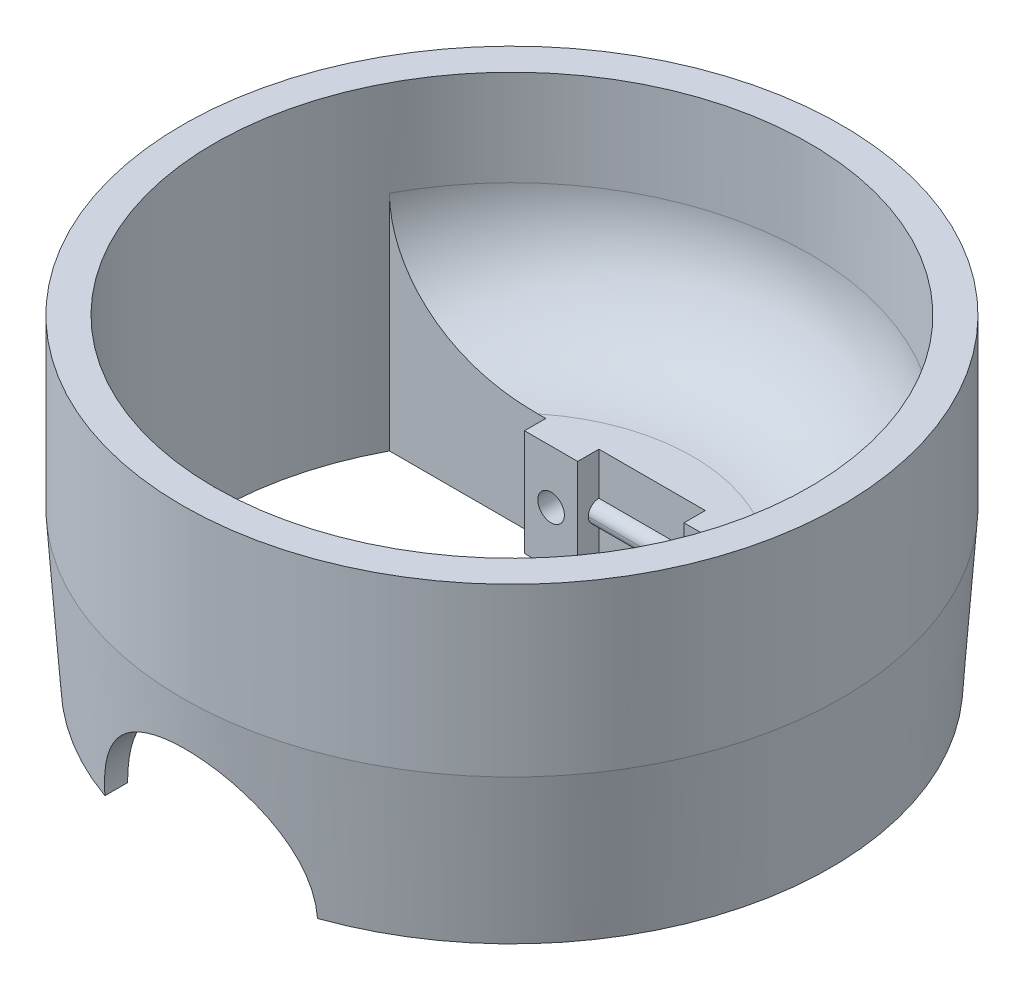
ISO-10303-21;
HEADER;
FILE_DESCRIPTION(('STEP AP214'),'2;1');
FILE_NAME('part.step','',(''),(''),'','','');
FILE_SCHEMA(('AUTOMOTIVE_DESIGN { 1 0 10303 214 1 1 1 1 }'));
ENDSEC;
DATA;
#1=APPLICATION_CONTEXT('core data for automotive mechanical design processes');
#2=APPLICATION_PROTOCOL_DEFINITION('international standard','automotive_design',2000,#1);
#3=PRODUCT_CONTEXT('',#1,'mechanical');
#4=PRODUCT('Part','Part','',(#3));
#5=PRODUCT_RELATED_PRODUCT_CATEGORY('part','',(#4));
#6=PRODUCT_DEFINITION_FORMATION('','',#4);
#7=PRODUCT_DEFINITION_CONTEXT('part definition',#1,'design');
#8=PRODUCT_DEFINITION('design','',#6,#7);
#9=PRODUCT_DEFINITION_SHAPE('','',#8);
#10=(LENGTH_UNIT() NAMED_UNIT(*) SI_UNIT(.MILLI.,.METRE.));
#11=(NAMED_UNIT(*) PLANE_ANGLE_UNIT() SI_UNIT($,.RADIAN.));
#12=(NAMED_UNIT(*) SI_UNIT($,.STERADIAN.) SOLID_ANGLE_UNIT());
#13=UNCERTAINTY_MEASURE_WITH_UNIT(LENGTH_MEASURE(1.E-05),#10,'distance_accuracy_value','');
#14=(GEOMETRIC_REPRESENTATION_CONTEXT(3) GLOBAL_UNCERTAINTY_ASSIGNED_CONTEXT((#13)) GLOBAL_UNIT_ASSIGNED_CONTEXT((#10,
#11,#12)) REPRESENTATION_CONTEXT('',''));
#15=CARTESIAN_POINT('',(0.,0.,0.));
#16=DIRECTION('',(0.,0.,1.));
#17=DIRECTION('',(1.,0.,0.));
#18=AXIS2_PLACEMENT_3D('',#15,#16,#17);
#19=CARTESIAN_POINT('',(-24.7019057064772,-20.,-13.1839240921779));
#20=DIRECTION('',(0.,0.,1.));
#21=DIRECTION('',(1.,0.,0.));
#22=AXIS2_PLACEMENT_3D('',#19,#20,#21);
#23=PLANE('',#22);
#24=DIRECTION('',(0.,-1.,0.));
#25=VECTOR('',#24,1.);
#26=CARTESIAN_POINT('',(5.,0.,-13.1839240921779));
#27=LINE('',#26,#25);
#28=CARTESIAN_POINT('',(5.,-26.,-13.1839240921779));
#29=VERTEX_POINT('',#28);
#30=CARTESIAN_POINT('',(5.,-30.,-13.1839240921779));
#31=VERTEX_POINT('',#30);
#32=EDGE_CURVE('E216',#29,#31,#27,.T.);
#33=ORIENTED_EDGE('',*,*,#32,.F.);
#34=DIRECTION('',(1.,0.,0.));
#35=VECTOR('',#34,1.);
#36=CARTESIAN_POINT('',(0.,-26.,-13.1839240921779));
#37=LINE('',#36,#35);
#38=CARTESIAN_POINT('',(-5.,-26.,-13.1839240921779));
#39=VERTEX_POINT('',#38);
#40=EDGE_CURVE('E188',#39,#29,#37,.T.);
#41=ORIENTED_EDGE('',*,*,#40,.F.);
#42=DIRECTION('',(0.,-1.,0.));
#43=VECTOR('',#42,1.);
#44=CARTESIAN_POINT('',(-5.,0.,-13.1839240921779));
#45=LINE('',#44,#43);
#46=CARTESIAN_POINT('',(-5.,-30.,-13.1839240921779));
#47=VERTEX_POINT('',#46);
#48=EDGE_CURVE('E185',#39,#47,#45,.T.);
#49=ORIENTED_EDGE('',*,*,#48,.T.);
#50=DIRECTION('',(-1.,0.,0.));
#51=VECTOR('',#50,1.);
#52=CARTESIAN_POINT('',(-24.7019057064772,-30.,-13.1839240921779));
#53=LINE('',#52,#51);
#54=EDGE_CURVE('E347',#31,#47,#53,.T.);
#55=ORIENTED_EDGE('',*,*,#54,.F.);
#56=EDGE_LOOP('',(#33,#41,#49,#55));
#57=FACE_BOUND('',#56,.T.);
#58=ADVANCED_FACE('F41',(#57),#23,.T.);
#59=DIRECTION('',(1.,0.,0.));
#60=VECTOR('',#59,1.);
#61=CARTESIAN_POINT('',(0.,-24.,-13.1839240921779));
#62=LINE('',#61,#60);
#63=CARTESIAN_POINT('',(-5.,-24.,-13.1839240921779));
#64=VERTEX_POINT('',#63);
#65=CARTESIAN_POINT('',(5.,-24.,-13.1839240921779));
#66=VERTEX_POINT('',#65);
#67=EDGE_CURVE('E180',#64,#66,#62,.T.);
#68=ORIENTED_EDGE('',*,*,#67,.T.);
#69=CARTESIAN_POINT('',(5.,-20.,-13.1839240921779));
#70=VERTEX_POINT('',#69);
#71=EDGE_CURVE('E203',#70,#66,#27,.T.);
#72=ORIENTED_EDGE('',*,*,#71,.F.);
#73=DIRECTION('',(-1.,0.,0.));
#74=VECTOR('',#73,1.);
#75=CARTESIAN_POINT('',(-24.7019057064772,-20.,-13.1839240921779));
#76=LINE('',#75,#74);
#77=CARTESIAN_POINT('',(-5.,-20.,-13.1839240921779));
#78=VERTEX_POINT('',#77);
#79=EDGE_CURVE('E182',#70,#78,#76,.T.);
#80=ORIENTED_EDGE('',*,*,#79,.T.);
#81=EDGE_CURVE('E166',#78,#64,#45,.T.);
#82=ORIENTED_EDGE('',*,*,#81,.T.);
#83=EDGE_LOOP('',(#68,#72,#80,#82));
#84=FACE_BOUND('',#83,.T.);
#85=ADVANCED_FACE('F178',(#84),#23,.T.);
#86=DIRECTION('',(0.,-1.,0.));
#87=VECTOR('',#86,1.);
#88=CARTESIAN_POINT('',(10.,0.,-13.1839240921779));
#89=LINE('',#88,#87);
#90=CARTESIAN_POINT('',(10.,-20.,-13.1839240921779));
#91=VERTEX_POINT('',#90);
#92=CARTESIAN_POINT('',(10.,-30.,-13.1839240921779));
#93=VERTEX_POINT('',#92);
#94=EDGE_CURVE('E192',#91,#93,#89,.T.);
#95=ORIENTED_EDGE('',*,*,#94,.T.);
#96=CARTESIAN_POINT('',(24.7019057064772,-30.,-13.1839240921779));
#97=VERTEX_POINT('',#96);
#98=EDGE_CURVE('E348',#97,#93,#53,.T.);
#99=ORIENTED_EDGE('',*,*,#98,.F.);
#100=DIRECTION('',(0.,-1.,0.));
#101=VECTOR('',#100,1.);
#102=CARTESIAN_POINT('',(24.7019057064772,-20.,-13.1839240921779));
#103=LINE('',#102,#101);
#104=CARTESIAN_POINT('',(24.7019057064772,-9.,-13.1839240921779));
#105=VERTEX_POINT('',#104);
#106=EDGE_CURVE('E362',#105,#97,#103,.T.);
#107=ORIENTED_EDGE('',*,*,#106,.F.);
#108=CARTESIAN_POINT('',(24.7019057064772,-9.,-13.1839240921779));
#109=CARTESIAN_POINT('',(24.7019507783362,-9.27982644663343,-13.1839240921779));
#110=CARTESIAN_POINT('',(24.6898044805069,-9.55964059119396,-13.1839240921779));
#111=CARTESIAN_POINT('',(24.6414590490719,-10.1171294383438,-13.1839240921779));
#112=CARTESIAN_POINT('',(24.6052646821188,-10.394804553886,-13.1839240921779));
#113=CARTESIAN_POINT('',(24.509300887252,-10.9451636026621,-13.1839240921779));
#114=CARTESIAN_POINT('',(24.4496044632105,-11.2178602813995,-13.1839240921779));
#115=CARTESIAN_POINT('',(24.3072583488006,-11.757193561209,-13.1839240921779));
#116=CARTESIAN_POINT('',(24.2246083214414,-12.0238300732472,-13.1839240921779));
#117=CARTESIAN_POINT('',(24.0372112200552,-12.5491168110302,-13.1839240921779));
#118=CARTESIAN_POINT('',(23.9324712234703,-12.8077695643504,-13.1839240921779));
#119=CARTESIAN_POINT('',(23.7018983862071,-13.3154991518267,-13.1839240921779));
#120=CARTESIAN_POINT('',(23.5760646086041,-13.5645755600248,-13.1839240921779));
#121=CARTESIAN_POINT('',(23.3044322203473,-14.0517395184423,-13.1839240921779));
#122=CARTESIAN_POINT('',(23.1586239372842,-14.2898216696864,-13.1839240921779));
#123=CARTESIAN_POINT('',(22.8484184771743,-14.7535391313424,-13.1839240921779));
#124=CARTESIAN_POINT('',(22.6840209857017,-14.9791742311236,-13.1839240921779));
#125=CARTESIAN_POINT('',(22.3327163499352,-15.4236427412816,-13.1839240921779));
#126=CARTESIAN_POINT('',(22.1452702508676,-15.642049910618,-13.1839240921779));
#127=CARTESIAN_POINT('',(21.7537936591684,-16.0634376349728,-13.1839240921779));
#128=CARTESIAN_POINT('',(21.549762883154,-16.2664179262771,-13.1839240921779));
#129=CARTESIAN_POINT('',(21.1269375121556,-16.6560774566455,-13.1839240921779));
#130=CARTESIAN_POINT('',(20.9081519514772,-16.8427665129788,-13.1839240921779));
#131=CARTESIAN_POINT('',(20.4573851965118,-17.1994811308012,-13.1839240921779));
#132=CARTESIAN_POINT('',(20.2254026151171,-17.369504935512,-13.1839240921779));
#133=CARTESIAN_POINT('',(19.7264926113907,-17.7085048747275,-13.1839240921779));
#134=CARTESIAN_POINT('',(19.4583739496668,-17.8757279612194,-13.1839240921779));
#135=CARTESIAN_POINT('',(18.9103730872713,-18.1896210332199,-13.1839240921779));
#136=CARTESIAN_POINT('',(18.6304898333286,-18.3362891733499,-13.1839240921779));
#137=CARTESIAN_POINT('',(18.0601205947954,-18.6096921459424,-13.1839240921779));
#138=CARTESIAN_POINT('',(17.7696048443542,-18.7363647445235,-13.1839240921779));
#139=CARTESIAN_POINT('',(17.1807227297072,-18.969704554264,-13.1839240921779));
#140=CARTESIAN_POINT('',(16.8823568808151,-19.0763730748583,-13.1839240921779));
#141=CARTESIAN_POINT('',(16.1086431771858,-19.3253978749337,-13.1839240921779));
#142=CARTESIAN_POINT('',(15.6287489220259,-19.4537592409069,-13.1839240921779));
#143=CARTESIAN_POINT('',(14.6590162853255,-19.6670157596428,-13.1839240921779));
#144=CARTESIAN_POINT('',(14.1691661889671,-19.7518562063045,-13.1839240921779));
#145=CARTESIAN_POINT('',(13.1882927228058,-19.8821958455143,-13.1839240921779));
#146=CARTESIAN_POINT('',(12.6973091186484,-19.9280002201832,-13.1839240921779));
#147=CARTESIAN_POINT('',(11.960210248636,-19.9721680445016,-13.1839240921779));
#148=CARTESIAN_POINT('',(11.7147321228962,-19.9828029414737,-13.1839240921779));
#149=CARTESIAN_POINT('',(11.2236322997369,-19.9967197069818,-13.1839240921779));
#150=CARTESIAN_POINT('',(10.9780106616034,-20.0000036293571,-13.1839240921779));
#151=CARTESIAN_POINT('',(10.7323876901504,-20.,-13.1839240921779));
#152=B_SPLINE_CURVE_WITH_KNOTS('',3,(#108,#109,#110,#111,#112,#113,#114,#115,#116,#117,#118,
#119,#120,#121,#122,#123,#124,#125,#126,#127,#128,#129,#130,#131,#132,#133,#134,#135,#136,#137,
#138,#139,#140,#141,#142,#143,#144,#145,#146,#147,#148,#149,#150,#151),.UNSPECIFIED.,.F.,.F.,(4,
2,2,2,2,2,2,2,2,2,2,2,2,2,2,2,2,2,2,2,2,4),(0.,0.839197067847004,1.67822784509287,
2.51467266834941,3.35112977242514,4.18731928863131,5.02354595580059,5.86017899633741,
6.69682619016163,7.55935118826625,8.42189092745133,9.28390724908399,10.1460143432244,
11.0930449518426,12.0401605284291,12.9901681230241,13.9401135099279,15.4279767727252,
16.9177057351677,18.3956783400627,19.1327156267729,19.8695469618545),.UNSPECIFIED.);
#153=CARTESIAN_POINT('',(10.7323876901504,-20.,-13.1839240921779));
#154=VERTEX_POINT('',#153);
#155=EDGE_CURVE('E55',#105,#154,#152,.T.);
#156=ORIENTED_EDGE('',*,*,#155,.T.);
#157=EDGE_CURVE('E269',#154,#91,#76,.T.);
#158=ORIENTED_EDGE('',*,*,#157,.T.);
#159=EDGE_LOOP('',(#95,#99,#107,#156,#158));
#160=FACE_BOUND('',#159,.T.);
#161=ADVANCED_FACE('F334',(#160),#23,.T.);
#162=CARTESIAN_POINT('',(-10.,-30.,-13.1839240921779));
#163=VERTEX_POINT('',#162);
#164=CARTESIAN_POINT('',(-24.7019057064772,-30.,-13.1839240921779));
#165=VERTEX_POINT('',#164);
#166=EDGE_CURVE('E268',#163,#165,#53,.T.);
#167=ORIENTED_EDGE('',*,*,#166,.F.);
#168=DIRECTION('',(0.,-1.,0.));
#169=VECTOR('',#168,1.);
#170=CARTESIAN_POINT('',(-10.,0.,-13.1839240921779));
#171=LINE('',#170,#169);
#172=CARTESIAN_POINT('',(-10.,-20.,-13.1839240921779));
#173=VERTEX_POINT('',#172);
#174=EDGE_CURVE('E229',#173,#163,#171,.T.);
#175=ORIENTED_EDGE('',*,*,#174,.F.);
#176=CARTESIAN_POINT('',(-10.7323876901504,-20.,-13.1839240921779));
#177=VERTEX_POINT('',#176);
#178=EDGE_CURVE('E359',#173,#177,#76,.T.);
#179=ORIENTED_EDGE('',*,*,#178,.T.);
#180=CARTESIAN_POINT('',(-10.7323876901504,-20.,-13.1839240921779));
#181=CARTESIAN_POINT('',(-11.0218787992796,-20.0000141704791,-13.1839240921779));
#182=CARTESIAN_POINT('',(-11.3114184178669,-19.9954451439697,-13.1839240921779));
#183=CARTESIAN_POINT('',(-11.8902745328998,-19.9759055288924,-13.1839240921779));
#184=CARTESIAN_POINT('',(-12.1795908617473,-19.960930078426,-13.1839240921779));
#185=CARTESIAN_POINT('',(-12.7587993681966,-19.9192400342375,-13.1839240921779));
#186=CARTESIAN_POINT('',(-13.0486876143698,-19.8924692817555,-13.1839240921779));
#187=CARTESIAN_POINT('',(-13.6269578544484,-19.8260393365202,-13.1839240921779));
#188=CARTESIAN_POINT('',(-13.9153400538652,-19.7863819515493,-13.1839240921779));
#189=CARTESIAN_POINT('',(-14.4927088492038,-19.6926635840186,-13.1839240921779));
#190=CARTESIAN_POINT('',(-14.7816731054147,-19.6384637356711,-13.1839240921779));
#191=CARTESIAN_POINT('',(-15.356330967273,-19.5148790261105,-13.1839240921779));
#192=CARTESIAN_POINT('',(-15.6420248334325,-19.4454953833889,-13.1839240921779));
#193=CARTESIAN_POINT('',(-16.2085058932891,-19.2908439103934,-13.1839240921779));
#194=CARTESIAN_POINT('',(-16.4893015533208,-19.2056072528542,-13.1839240921779));
#195=CARTESIAN_POINT('',(-17.0452362661913,-19.0184855999594,-13.1839240921779));
#196=CARTESIAN_POINT('',(-17.320376518838,-18.9166041777409,-13.1839240921779));
#197=CARTESIAN_POINT('',(-17.9035295658578,-18.6794250430918,-13.1839240921779));
#198=CARTESIAN_POINT('',(-18.210448741728,-18.5414181273483,-13.1839240921779));
#199=CARTESIAN_POINT('',(-18.8128428827323,-18.2422365687576,-13.1839240921779));
#200=CARTESIAN_POINT('',(-19.1083169102506,-18.0810600328701,-13.1839240921779));
#201=CARTESIAN_POINT('',(-19.6842058884858,-17.7360331813031,-13.1839240921779));
#202=CARTESIAN_POINT('',(-19.9646746779218,-17.5522729996891,-13.1839240921779));
#203=CARTESIAN_POINT('',(-20.5091758599231,-17.1617980955601,-13.1839240921779));
#204=CARTESIAN_POINT('',(-20.7732088764774,-16.9550842453184,-13.1839240921779));
#205=CARTESIAN_POINT('',(-21.2842274284973,-16.5175513542208,-13.1839240921779));
#206=CARTESIAN_POINT('',(-21.5310589288472,-16.286551961841,-13.1839240921779));
#207=CARTESIAN_POINT('',(-22.0025770623019,-15.8028961323451,-13.1839240921779));
#208=CARTESIAN_POINT('',(-22.2272626150121,-15.5502386397573,-13.1839240921779));
#209=CARTESIAN_POINT('',(-22.6520044514805,-15.0245311850881,-13.1839240921779));
#210=CARTESIAN_POINT('',(-22.8520344519494,-14.7514599511422,-13.1839240921779));
#211=CARTESIAN_POINT('',(-23.2246043806973,-14.1871822776315,-13.1839240921779));
#212=CARTESIAN_POINT('',(-23.3971486322939,-13.895978700201,-13.1839240921779));
#213=CARTESIAN_POINT('',(-23.6963134568623,-13.3284705142301,-13.1839240921779));
#214=CARTESIAN_POINT('',(-23.8258257862493,-13.0536871267521,-13.1839240921779));
#215=CARTESIAN_POINT('',(-24.0593756556695,-12.493507902747,-13.1839240921779));
#216=CARTESIAN_POINT('',(-24.1634159664085,-12.208113224351,-13.1839240921779));
#217=CARTESIAN_POINT('',(-24.3446338208219,-11.629539751225,-13.1839240921779));
#218=CARTESIAN_POINT('',(-24.421863917977,-11.3363774114555,-13.1839240921779));
#219=CARTESIAN_POINT('',(-24.5487895556623,-10.7442863145121,-13.1839240921779));
#220=CARTESIAN_POINT('',(-24.5985010729015,-10.4453610077443,-13.1839240921779));
#221=CARTESIAN_POINT('',(-24.6567339252384,-9.95475388603851,-13.1839240921779));
#222=CARTESIAN_POINT('',(-24.6736788498507,-9.7640329957569,-13.1839240921779));
#223=CARTESIAN_POINT('',(-24.6962589744793,-9.38221645300072,-13.1839240921779));
#224=CARTESIAN_POINT('',(-24.7019114658686,-9.19112182268412,-13.1839240921779));
#225=CARTESIAN_POINT('',(-24.7019057064772,-9.,-13.1839240921779));
#226=B_SPLINE_CURVE_WITH_KNOTS('',3,(#180,#181,#182,#183,#184,#185,#186,#187,#188,#189,#190,
#191,#192,#193,#194,#195,#196,#197,#198,#199,#200,#201,#202,#203,#204,#205,#206,#207,#208,#209,
#210,#211,#212,#213,#214,#215,#216,#217,#218,#219,#220,#221,#222,#223,#224,#225),.UNSPECIFIED.,
.F.,.F.,(4,2,2,2,2,2,2,2,2,2,2,2,2,2,2,2,2,2,2,2,2,2,4),(0.,0.868509246433922,1.7374245348834,
2.61052229999916,3.48349763670163,4.36512549317318,5.24668262540023,6.12652428261805,
7.00617731153202,8.01477900612634,9.02346315394461,10.0282448489454,11.0329883738127,
12.0458055938371,13.0586721999259,14.0726093705996,15.0863868981689,15.9965036522632,
16.9065213648515,17.8147450490537,18.7224408831645,19.2965489996396,19.8697773455954),.UNSPECIFIED.);
#227=CARTESIAN_POINT('',(-24.7019057064772,-9.,-13.1839240921779));
#228=VERTEX_POINT('',#227);
#229=EDGE_CURVE('E11',#177,#228,#226,.T.);
#230=ORIENTED_EDGE('',*,*,#229,.T.);
#231=DIRECTION('',(0.,-1.,0.));
#232=VECTOR('',#231,1.);
#233=CARTESIAN_POINT('',(-24.7019057064772,-20.,-13.1839240921779));
#234=LINE('',#233,#232);
#235=EDGE_CURVE('E344',#228,#165,#234,.T.);
#236=ORIENTED_EDGE('',*,*,#235,.T.);
#237=EDGE_LOOP('',(#167,#175,#179,#230,#236));
#238=FACE_BOUND('',#237,.T.);
#239=ADVANCED_FACE('F316',(#238),#23,.T.);
#240=CARTESIAN_POINT('',(0.,-30.,0.));
#241=DIRECTION('',(0.,1.,0.));
#242=DIRECTION('',(0.,0.,1.));
#243=AXIS2_PLACEMENT_3D('',#240,#241,#242);
#244=CYLINDRICAL_SURFACE('',#243,31.);
#245=CARTESIAN_POINT('',(0.,-15.6993337432872,0.));
#246=DIRECTION('',(0.,1.,0.));
#247=DIRECTION('',(0.,0.,1.));
#248=AXIS2_PLACEMENT_3D('',#245,#246,#247);
#249=CIRCLE('',#248,31.);
#250=CARTESIAN_POINT('',(10.3333333333334,-15.6993337432872,29.227080289044));
#251=VERTEX_POINT('',#250);
#252=EDGE_CURVE('E382',#251,#251,#249,.T.);
#253=ORIENTED_EDGE('',*,*,#252,.T.);
#254=EDGE_LOOP('',(#253));
#255=FACE_BOUND('',#254,.T.);
#256=CARTESIAN_POINT('',(0.,0.,0.));
#257=DIRECTION('',(0.,1.,0.));
#258=DIRECTION('',(0.,0.,1.));
#259=AXIS2_PLACEMENT_3D('',#256,#257,#258);
#260=CIRCLE('',#259,31.);
#261=CARTESIAN_POINT('',(0.,0.,31.));
#262=VERTEX_POINT('',#261);
#263=EDGE_CURVE('E373',#262,#262,#260,.T.);
#264=ORIENTED_EDGE('',*,*,#263,.F.);
#265=EDGE_LOOP('',(#264));
#266=FACE_BOUND('',#265,.T.);
#267=ADVANCED_FACE('F312',(#255,#266),#244,.T.);
#268=CARTESIAN_POINT('',(0.,-30.,0.));
#269=DIRECTION('',(0.,1.,0.));
#270=DIRECTION('',(0.,0.,1.));
#271=AXIS2_PLACEMENT_3D('',#268,#269,#270);
#272=PLANE('',#271);
#273=DIRECTION('',(0.,0.,-1.));
#274=VECTOR('',#273,1.);
#275=CARTESIAN_POINT('',(-10.,-30.,37.8160759078221));
#276=LINE('',#275,#274);
#277=CARTESIAN_POINT('',(-10.,-30.,28.2842712474618));
#278=VERTEX_POINT('',#277);
#279=CARTESIAN_POINT('',(-10.,-30.,26.153393661244));
#280=VERTEX_POINT('',#279);
#281=EDGE_CURVE('E257',#278,#280,#276,.T.);
#282=ORIENTED_EDGE('',*,*,#281,.F.);
#283=CARTESIAN_POINT('',(0.,-30.,0.));
#284=DIRECTION('',(0.,1.,0.));
#285=DIRECTION('',(0.,0.,1.));
#286=AXIS2_PLACEMENT_3D('',#283,#284,#285);
#287=CIRCLE('',#286,29.9999999999999);
#288=CARTESIAN_POINT('',(10.,-30.,28.2842712474618));
#289=VERTEX_POINT('',#288);
#290=EDGE_CURVE('E294',#278,#289,#287,.F.);
#291=ORIENTED_EDGE('',*,*,#290,.T.);
#292=DIRECTION('',(0.,0.,-1.));
#293=VECTOR('',#292,1.);
#294=CARTESIAN_POINT('',(10.,-30.,37.8160759078221));
#295=LINE('',#294,#293);
#296=CARTESIAN_POINT('',(10.,-30.,26.153393661244));
#297=VERTEX_POINT('',#296);
#298=EDGE_CURVE('E255',#289,#297,#295,.T.);
#299=ORIENTED_EDGE('',*,*,#298,.T.);
#300=CARTESIAN_POINT('',(0.,-30.,0.));
#301=DIRECTION('',(0.,1.,0.));
#302=DIRECTION('',(0.,0.,1.));
#303=AXIS2_PLACEMENT_3D('',#300,#301,#302);
#304=CIRCLE('',#303,28.);
#305=EDGE_CURVE('E374',#297,#97,#304,.T.);
#306=ORIENTED_EDGE('',*,*,#305,.T.);
#307=ORIENTED_EDGE('',*,*,#98,.T.);
#308=DIRECTION('',(0.,0.,-1.));
#309=VECTOR('',#308,1.);
#310=CARTESIAN_POINT('',(10.,-30.,-11.1839240921779));
#311=LINE('',#310,#309);
#312=CARTESIAN_POINT('',(10.,-30.,-11.1839240921779));
#313=VERTEX_POINT('',#312);
#314=EDGE_CURVE('E214',#313,#93,#311,.T.);
#315=ORIENTED_EDGE('',*,*,#314,.F.);
#316=DIRECTION('',(1.,0.,0.));
#317=VECTOR('',#316,1.);
#318=CARTESIAN_POINT('',(0.,-30.,-11.1839240921779));
#319=LINE('',#318,#317);
#320=CARTESIAN_POINT('',(5.,-30.,-11.1839240921779));
#321=VERTEX_POINT('',#320);
#322=EDGE_CURVE('E212',#321,#313,#319,.T.);
#323=ORIENTED_EDGE('',*,*,#322,.F.);
#324=DIRECTION('',(0.,0.,-1.));
#325=VECTOR('',#324,1.);
#326=CARTESIAN_POINT('',(5.,-30.,-11.1839240921779));
#327=LINE('',#326,#325);
#328=EDGE_CURVE('E220',#321,#31,#327,.T.);
#329=ORIENTED_EDGE('',*,*,#328,.T.);
#330=ORIENTED_EDGE('',*,*,#54,.T.);
#331=DIRECTION('',(0.,0.,-1.));
#332=VECTOR('',#331,1.);
#333=CARTESIAN_POINT('',(-5.,-30.,-11.1839240921779));
#334=LINE('',#333,#332);
#335=CARTESIAN_POINT('',(-5.,-30.,-11.1839240921779));
#336=VERTEX_POINT('',#335);
#337=EDGE_CURVE('E246',#336,#47,#334,.T.);
#338=ORIENTED_EDGE('',*,*,#337,.F.);
#339=DIRECTION('',(1.,0.,0.));
#340=VECTOR('',#339,1.);
#341=CARTESIAN_POINT('',(0.,-30.,-11.1839240921779));
#342=LINE('',#341,#340);
#343=CARTESIAN_POINT('',(-10.,-30.,-11.1839240921779));
#344=VERTEX_POINT('',#343);
#345=EDGE_CURVE('E237',#344,#336,#342,.T.);
#346=ORIENTED_EDGE('',*,*,#345,.F.);
#347=DIRECTION('',(0.,0.,-1.));
#348=VECTOR('',#347,1.);
#349=CARTESIAN_POINT('',(-10.,-30.,-11.1839240921779));
#350=LINE('',#349,#348);
#351=EDGE_CURVE('E249',#344,#163,#350,.T.);
#352=ORIENTED_EDGE('',*,*,#351,.T.);
#353=ORIENTED_EDGE('',*,*,#166,.T.);
#354=EDGE_CURVE('E371',#165,#280,#304,.T.);
#355=ORIENTED_EDGE('',*,*,#354,.T.);
#356=EDGE_LOOP('',(#282,#291,#299,#306,#307,#315,#323,#329,#330,#338,#346,#352,#353,#355));
#357=FACE_BOUND('',#356,.T.);
#358=ADVANCED_FACE('F315',(#357),#272,.F.);
#359=CARTESIAN_POINT('',(0.,-30.,0.));
#360=DIRECTION('',(0.,1.,0.));
#361=DIRECTION('',(0.,0.,1.));
#362=AXIS2_PLACEMENT_3D('',#359,#360,#361);
#363=CYLINDRICAL_SURFACE('',#362,28.);
#364=CARTESIAN_POINT('',(0.,0.,0.));
#365=DIRECTION('',(0.,1.,0.));
#366=DIRECTION('',(0.,0.,1.));
#367=AXIS2_PLACEMENT_3D('',#364,#365,#366);
#368=CIRCLE('',#367,28.);
#369=CARTESIAN_POINT('',(0.,0.,28.));
#370=VERTEX_POINT('',#369);
#371=EDGE_CURVE('E368',#370,#370,#368,.T.);
#372=ORIENTED_EDGE('',*,*,#371,.T.);
#373=EDGE_LOOP('',(#372));
#374=FACE_BOUND('',#373,.T.);
#375=CARTESIAN_POINT('',(0.,-9.,0.));
#376=DIRECTION('',(0.,-1.,0.));
#377=DIRECTION('',(0.,0.,-1.));
#378=AXIS2_PLACEMENT_3D('',#375,#376,#377);
#379=CIRCLE('',#378,28.);
#380=EDGE_CURVE('E293',#228,#105,#379,.T.);
#381=ORIENTED_EDGE('',*,*,#380,.T.);
#382=ORIENTED_EDGE('',*,*,#106,.T.);
#383=ORIENTED_EDGE('',*,*,#305,.F.);
#384=CARTESIAN_POINT('',(-10.,-30.,26.153393661244));
#385=CARTESIAN_POINT('',(-10.0000400490394,-29.7284478794139,26.1533448402773));
#386=CARTESIAN_POINT('',(-9.9889407829517,-29.4569147001927,26.1576213400309));
#387=CARTESIAN_POINT('',(-9.94476270524569,-28.9159819274189,26.1744669515593));
#388=CARTESIAN_POINT('',(-9.91169062352206,-28.6465817061357,26.1870335242193));
#389=CARTESIAN_POINT('',(-9.82400976091198,-28.1127191850931,26.2200474023107));
#390=CARTESIAN_POINT('',(-9.76947200797283,-27.8482435826362,26.2404687121123));
#391=CARTESIAN_POINT('',(-9.63939500882629,-27.325175730822,26.2885316704833));
#392=CARTESIAN_POINT('',(-9.56385483380789,-27.0665837422088,26.3161736383758));
#393=CARTESIAN_POINT('',(-9.39253539386503,-26.5572677660855,26.3778039072718));
#394=CARTESIAN_POINT('',(-9.29677598447924,-26.3065363348173,26.4117859784327));
#395=CARTESIAN_POINT('',(-9.08572566367805,-25.8141468694286,26.4851291788929));
#396=CARTESIAN_POINT('',(-8.97042747255219,-25.5724922582731,26.5244923119944));
#397=CARTESIAN_POINT('',(-8.72113159078407,-25.0996602983825,26.6075012314743));
#398=CARTESIAN_POINT('',(-8.58712527514474,-24.8684878477298,26.6511489904206));
#399=CARTESIAN_POINT('',(-8.30136098634424,-24.4180145069417,26.7415380725172));
#400=CARTESIAN_POINT('',(-8.14960183113401,-24.1987144087347,26.788279601572));
#401=CARTESIAN_POINT('',(-7.82276842977781,-23.7645291663589,26.8855821346688));
#402=CARTESIAN_POINT('',(-7.64699718607697,-23.5501858854378,26.9362211636313));
#403=CARTESIAN_POINT('',(-7.27836447064244,-23.1369038611162,27.0381577528226));
#404=CARTESIAN_POINT('',(-7.08550263215356,-22.937965448468,27.0894553271632));
#405=CARTESIAN_POINT('',(-6.68380099803456,-22.556646671795,27.1913541503837));
#406=CARTESIAN_POINT('',(-6.47495801490467,-22.3742696269428,27.2419552579636));
#407=CARTESIAN_POINT('',(-6.0425592571072,-22.0272765604206,27.3411168555465));
#408=CARTESIAN_POINT('',(-5.81900393148442,-21.862659997076,27.3896774077565));
#409=CARTESIAN_POINT('',(-5.35139229430774,-21.5475141802753,27.4849278260831));
#410=CARTESIAN_POINT('',(-5.10691666322239,-21.3975748435313,27.5315140355344));
#411=CARTESIAN_POINT('',(-4.60540915349066,-21.1189836404093,27.6198298034925));
#412=CARTESIAN_POINT('',(-4.34838233141645,-20.9903232914047,27.6615612952998));
#413=CARTESIAN_POINT('',(-3.82344973807693,-20.7553303594447,27.7389906944706));
#414=CARTESIAN_POINT('',(-3.55554461706769,-20.6489964442529,27.7746889618166));
#415=CARTESIAN_POINT('',(-3.0107916514674,-20.4596502953357,27.8390074448316));
#416=CARTESIAN_POINT('',(-2.7339442532349,-20.3766368995538,27.8676280131724));
#417=CARTESIAN_POINT('',(-2.18450257245506,-20.2375690568347,27.9159627964252));
#418=CARTESIAN_POINT('',(-1.91217173813567,-20.1805798380073,27.9359839665184));
#419=CARTESIAN_POINT('',(-1.36325145865027,-20.0894530337297,27.9681447082284));
#420=CARTESIAN_POINT('',(-1.08666211567051,-20.0553149008212,27.9802844686651));
#421=CARTESIAN_POINT('',(-0.531425856053532,-20.0102477777854,27.996333786917));
#422=CARTESIAN_POINT('',(-0.252779437292607,-19.9993133452359,28.0002452746697));
#423=CARTESIAN_POINT('',(0.304441753103159,-20.0007533797397,27.9997308950177));
#424=CARTESIAN_POINT('',(0.583016526471362,-20.0131272166281,27.9953052530165));
#425=CARTESIAN_POINT('',(1.12540709922492,-20.0599702420595,27.9786301360333));
#426=CARTESIAN_POINT('',(1.38932283297937,-20.0934198452943,27.9667417795857));
#427=CARTESIAN_POINT('',(1.91323348637203,-20.1811366423858,27.9357905580261));
#428=CARTESIAN_POINT('',(2.17322854486424,-20.2354030971882,27.9167279476199));
#429=CARTESIAN_POINT('',(2.68749546577106,-20.3642525219436,27.8719210960483));
#430=CARTESIAN_POINT('',(2.9417682077587,-20.4388323461309,27.8461778894815));
#431=CARTESIAN_POINT('',(3.44307756049189,-20.6077050538971,27.7886470363828));
#432=CARTESIAN_POINT('',(3.69011138154558,-20.7020054262546,27.7568570940495));
#433=CARTESIAN_POINT('',(4.17863115031134,-20.9109637111642,27.6875556294032));
#434=CARTESIAN_POINT('',(4.4199956338174,-21.0258815108317,27.6499720461691));
#435=CARTESIAN_POINT('',(4.89226864627417,-21.2743519937931,27.5703297819967));
#436=CARTESIAN_POINT('',(5.12317328717901,-21.4079115323636,27.5282694561469));
#437=CARTESIAN_POINT('',(5.57313610149373,-21.6927108026744,27.4407123929084));
#438=CARTESIAN_POINT('',(5.79219354983488,-21.8439516147524,27.3952154455998));
#439=CARTESIAN_POINT('',(6.21725487904516,-22.1631390678452,27.3018882111535));
#440=CARTESIAN_POINT('',(6.42325821177716,-22.3310864096007,27.2540578261846));
#441=CARTESIAN_POINT('',(6.83179063741914,-22.6921354697162,27.1546161243977));
#442=CARTESIAN_POINT('',(7.03353880129724,-22.8861037569039,27.1029397161072));
#443=CARTESIAN_POINT('',(7.42000729703878,-23.2901845420682,26.999694278752));
#444=CARTESIAN_POINT('',(7.60473454597011,-23.5002904177313,26.9481252144662));
#445=CARTESIAN_POINT('',(7.95624106981976,-23.9356323011007,26.8464473548651));
#446=CARTESIAN_POINT('',(8.12300620810631,-24.1608800026306,26.7963397320315));
#447=CARTESIAN_POINT('',(8.4372422344126,-24.6249249065537,26.6990635426653));
#448=CARTESIAN_POINT('',(8.58472076368906,-24.8637166887609,26.6518938160563));
#449=CARTESIAN_POINT('',(8.86206517568077,-25.3582625471318,26.5609774541375));
#450=CARTESIAN_POINT('',(8.99153164971724,-25.6142565492578,26.5173154791243));
#451=CARTESIAN_POINT('',(9.22823530609283,-26.1371016174707,26.4358722632974));
#452=CARTESIAN_POINT('',(9.33548186632715,-26.403948046181,26.3980885432553));
#453=CARTESIAN_POINT('',(9.5267089413742,-26.9464085000474,26.3296817291043));
#454=CARTESIAN_POINT('',(9.61071569708724,-27.2220122415833,26.2990505649337));
#455=CARTESIAN_POINT('',(9.75473856049515,-27.7800700512928,26.245969955064));
#456=CARTESIAN_POINT('',(9.81476554845649,-28.0625209508814,26.2235167991915));
#457=CARTESIAN_POINT('',(9.90818330723278,-28.6200336944214,26.1883643054768));
#458=CARTESIAN_POINT('',(9.94259562423713,-28.8949009902868,26.175291740277));
#459=CARTESIAN_POINT('',(9.98851234596744,-29.4465048245865,26.1577851441455));
#460=CARTESIAN_POINT('',(10.0000420843329,-29.7232389551155,26.1533415600595));
#461=CARTESIAN_POINT('',(10.,-30.,26.153393661244));
#462=B_SPLINE_CURVE_WITH_KNOTS('',3,(#384,#385,#386,#387,#388,#389,#390,#391,#392,#393,#394,
#395,#396,#397,#398,#399,#400,#401,#402,#403,#404,#405,#406,#407,#408,#409,#410,#411,#412,#413,
#414,#415,#416,#417,#418,#419,#420,#421,#422,#423,#424,#425,#426,#427,#428,#429,#430,#431,#432,
#433,#434,#435,#436,#437,#438,#439,#440,#441,#442,#443,#444,#445,#446,#447,#448,#449,#450,#451,
#452,#453,#454,#455,#456,#457,#458,#459,#460,#461),.UNSPECIFIED.,.F.,.F.,(4,2,2,2,2,2,2,2,2,2,2,
2,2,2,2,2,2,2,2,2,2,2,2,2,2,2,2,2,2,2,2,2,2,2,2,2,2,2,4),(0.,0.814366514239195,1.62848371696662,
2.43992942624744,3.25141102660841,4.06209941766893,4.8730905197375,5.68445675498354,
6.49587704474686,7.34028226051795,8.1847056011714,9.0292978064624,9.8738642453602,
10.7444386491434,11.6146651674529,12.484839743869,13.3549709519758,14.1907569230346,
15.0265228699115,15.8620927664142,16.6976400726807,17.4955792012676,18.2934900034878,
19.0912773099649,19.8893681240695,20.6983338951161,21.5075979413066,22.3169114599426,
23.1262589388445,23.9790782597611,24.8315494636944,25.684686755578,26.5374850081039,
27.4069085690575,28.2759644396992,29.1440349852232,30.0117112151897,30.8425945620029,
31.6725575113483),.UNSPECIFIED.);
#463=EDGE_CURVE('E259',#280,#297,#462,.T.);
#464=ORIENTED_EDGE('',*,*,#463,.F.);
#465=ORIENTED_EDGE('',*,*,#354,.F.);
#466=ORIENTED_EDGE('',*,*,#235,.F.);
#467=EDGE_LOOP('',(#381,#382,#383,#464,#465,#466));
#468=FACE_BOUND('',#467,.T.);
#469=ADVANCED_FACE('F271',(#374,#468),#363,.F.);
#470=CARTESIAN_POINT('',(0.,0.,0.));
#471=DIRECTION('',(0.,1.,0.));
#472=DIRECTION('',(0.,0.,1.));
#473=AXIS2_PLACEMENT_3D('',#470,#471,#472);
#474=PLANE('',#473);
#475=ORIENTED_EDGE('',*,*,#371,.F.);
#476=EDGE_LOOP('',(#475));
#477=FACE_BOUND('',#476,.T.);
#478=ORIENTED_EDGE('',*,*,#263,.T.);
#479=EDGE_LOOP('',(#478));
#480=FACE_BOUND('',#479,.T.);
#481=ADVANCED_FACE('F318',(#477,#480),#474,.T.);
#482=CARTESIAN_POINT('',(0.,-20.,0.));
#483=DIRECTION('',(0.,-1.,0.));
#484=DIRECTION('',(0.,0.,-1.));
#485=AXIS2_PLACEMENT_3D('',#482,#483,#484);
#486=PLANE('',#485);
#487=ORIENTED_EDGE('',*,*,#157,.F.);
#488=CARTESIAN_POINT('',(0.,-20.,0.));
#489=DIRECTION('',(0.,-1.,0.));
#490=DIRECTION('',(0.,0.,-1.));
#491=AXIS2_PLACEMENT_3D('',#488,#489,#490);
#492=CIRCLE('',#491,17.);
#493=EDGE_CURVE('E68',#154,#177,#492,.F.);
#494=ORIENTED_EDGE('',*,*,#493,.T.);
#495=ORIENTED_EDGE('',*,*,#178,.F.);
#496=DIRECTION('',(0.,0.,-1.));
#497=VECTOR('',#496,1.);
#498=CARTESIAN_POINT('',(-10.,-20.,-11.1839240921779));
#499=LINE('',#498,#497);
#500=CARTESIAN_POINT('',(-10.,-20.,-11.1839240921779));
#501=VERTEX_POINT('',#500);
#502=EDGE_CURVE('E252',#501,#173,#499,.T.);
#503=ORIENTED_EDGE('',*,*,#502,.F.);
#504=DIRECTION('',(-1.,0.,0.));
#505=VECTOR('',#504,1.);
#506=CARTESIAN_POINT('',(0.,-20.,-11.1839240921779));
#507=LINE('',#506,#505);
#508=CARTESIAN_POINT('',(-5.,-20.,-11.1839240921779));
#509=VERTEX_POINT('',#508);
#510=EDGE_CURVE('E232',#509,#501,#507,.T.);
#511=ORIENTED_EDGE('',*,*,#510,.F.);
#512=DIRECTION('',(0.,0.,-1.));
#513=VECTOR('',#512,1.);
#514=CARTESIAN_POINT('',(-5.,-20.,-11.1839240921779));
#515=LINE('',#514,#513);
#516=EDGE_CURVE('E242',#509,#78,#515,.T.);
#517=ORIENTED_EDGE('',*,*,#516,.T.);
#518=ORIENTED_EDGE('',*,*,#79,.F.);
#519=DIRECTION('',(0.,0.,-1.));
#520=VECTOR('',#519,1.);
#521=CARTESIAN_POINT('',(5.,-20.,-11.1839240921779));
#522=LINE('',#521,#520);
#523=CARTESIAN_POINT('',(5.,-20.,-11.1839240921779));
#524=VERTEX_POINT('',#523);
#525=EDGE_CURVE('E223',#524,#70,#522,.T.);
#526=ORIENTED_EDGE('',*,*,#525,.F.);
#527=DIRECTION('',(-1.,0.,0.));
#528=VECTOR('',#527,1.);
#529=CARTESIAN_POINT('',(0.,-20.,-11.1839240921779));
#530=LINE('',#529,#528);
#531=CARTESIAN_POINT('',(10.,-20.,-11.1839240921779));
#532=VERTEX_POINT('',#531);
#533=EDGE_CURVE('E206',#532,#524,#530,.T.);
#534=ORIENTED_EDGE('',*,*,#533,.F.);
#535=DIRECTION('',(0.,0.,-1.));
#536=VECTOR('',#535,1.);
#537=CARTESIAN_POINT('',(10.,-20.,-11.1839240921779));
#538=LINE('',#537,#536);
#539=EDGE_CURVE('E226',#532,#91,#538,.T.);
#540=ORIENTED_EDGE('',*,*,#539,.T.);
#541=EDGE_LOOP('',(#487,#494,#495,#503,#511,#517,#518,#526,#534,#540));
#542=FACE_BOUND('',#541,.T.);
#543=ADVANCED_FACE('F280',(#542),#486,.F.);
#544=CARTESIAN_POINT('',(0.,-30.,37.8160759078221));
#545=DIRECTION('',(0.,0.,-1.));
#546=DIRECTION('',(-1.,0.,0.));
#547=AXIS2_PLACEMENT_3D('',#544,#545,#546);
#548=CYLINDRICAL_SURFACE('',#547,10.);
#549=ORIENTED_EDGE('',*,*,#298,.F.);
#550=CARTESIAN_POINT('',(10.,-30.,28.2842712474618));
#551=CARTESIAN_POINT('',(10.0000369944679,-29.7219742998808,28.3048471887281));
#552=CARTESIAN_POINT('',(9.98840730955768,-29.4442906418838,28.3295829357977));
#553=CARTESIAN_POINT('',(9.94225232178153,-28.8917361538484,28.3867736648907));
#554=CARTESIAN_POINT('',(9.90773570728,-28.6168642965834,28.4192257146443));
#555=CARTESIAN_POINT('',(9.81638569153865,-28.0726923203456,28.4911535953516));
#556=CARTESIAN_POINT('',(9.75962175691036,-27.8033775785943,28.5306073558332));
#557=CARTESIAN_POINT('',(9.62441006203673,-27.2712482790961,28.6157645153948));
#558=CARTESIAN_POINT('',(9.54596075398578,-27.0084341867961,28.6614683604604));
#559=CARTESIAN_POINT('',(9.3682419845728,-26.4913400577115,28.7580783913411));
#560=CARTESIAN_POINT('',(9.26900018236502,-26.2370491990392,28.8089776203411));
#561=CARTESIAN_POINT('',(9.05041746759186,-25.7380559743227,28.9149556276881));
#562=CARTESIAN_POINT('',(8.93106914012618,-25.4933571868378,28.9700359438075));
#563=CARTESIAN_POINT('',(8.67310275489733,-25.01490261902,29.0832234081022));
#564=CARTESIAN_POINT('',(8.53447455944643,-24.7811526827901,29.1413321385532));
#565=CARTESIAN_POINT('',(8.23889656646418,-24.3260046637433,29.2593392772671));
#566=CARTESIAN_POINT('',(8.08194571911289,-24.1046072897574,29.3192377879313));
#567=CARTESIAN_POINT('',(7.74346128967942,-23.6660578438296,29.4422024105227));
#568=CARTESIAN_POINT('',(7.56115617439048,-23.4495076091573,29.5052931240132));
#569=CARTESIAN_POINT('',(7.17872097913463,-23.0325035796645,29.6306683544735));
#570=CARTESIAN_POINT('',(6.97859045844498,-22.8320501830622,29.6929528514665));
#571=CARTESIAN_POINT('',(6.56165245841825,-22.448512947211,29.8153259111685));
#572=CARTESIAN_POINT('',(6.34484313777475,-22.2654310307363,29.8754142303405));
#573=CARTESIAN_POINT('',(5.89584871261475,-21.9179491336488,29.9920177169204));
#574=CARTESIAN_POINT('',(5.66366446170537,-21.7535481172575,30.0485330823566));
#575=CARTESIAN_POINT('',(5.18267794389668,-21.4429740856086,30.1572735831356));
#576=CARTESIAN_POINT('',(4.93372106499027,-21.297021296556,30.2094447317474));
#577=CARTESIAN_POINT('',(4.42324726024659,-21.0268042366346,30.307491396646));
#578=CARTESIAN_POINT('',(4.16173581401423,-20.9025306114064,30.353369626434));
#579=CARTESIAN_POINT('',(3.62792586431274,-20.6767970080719,30.4376842969123));
#580=CARTESIAN_POINT('',(3.35562905944355,-20.5753334542492,30.4761219038664));
#581=CARTESIAN_POINT('',(2.80227120526771,-20.3962597724056,30.5445487595916));
#582=CARTESIAN_POINT('',(2.52121073054875,-20.3186480841505,30.5745385609527));
#583=CARTESIAN_POINT('',(1.9688877633783,-20.1918856895479,30.6238025321647));
#584=CARTESIAN_POINT('',(1.69798642588312,-20.1413591859584,30.6435921698194));
#585=CARTESIAN_POINT('',(1.15244972970001,-20.0628075725811,30.674450273751));
#586=CARTESIAN_POINT('',(0.877814513191869,-20.0347816084375,30.685519071162));
#587=CARTESIAN_POINT('',(0.327021920316347,-20.001542147624,30.6986541561084));
#588=CARTESIAN_POINT('',(0.0508649444954757,-19.9963229105578,30.7007227089824));
#589=CARTESIAN_POINT('',(-0.500850355004033,-20.0087399019787,30.6958105167116));
#590=CARTESIAN_POINT('',(-0.776408693568171,-20.026375555495,30.6888299992184));
#591=CARTESIAN_POINT('',(-1.31142181668412,-20.0828943905202,30.6665541980061));
#592=CARTESIAN_POINT('',(-1.57100850632258,-20.1207035673139,30.6516793900201));
#593=CARTESIAN_POINT('',(-2.08586478511043,-20.2164564106891,30.6142406465861));
#594=CARTESIAN_POINT('',(-2.34113454571122,-20.2743992756612,30.5916770172642));
#595=CARTESIAN_POINT('',(-2.8456188387566,-20.4098664816789,30.5393664269446));
#596=CARTESIAN_POINT('',(-3.09483431925872,-20.4873877349368,30.5096205987134));
#597=CARTESIAN_POINT('',(-3.58576951603947,-20.6613647623464,30.4435755477901));
#598=CARTESIAN_POINT('',(-3.82748634995558,-20.7578277154739,30.4072738408153));
#599=CARTESIAN_POINT('',(-4.30645983915033,-20.9709122181583,30.3281313931212));
#600=CARTESIAN_POINT('',(-4.54354109264106,-21.0878860418789,30.2851782384536));
#601=CARTESIAN_POINT('',(-5.00703199874696,-21.3397904453395,30.1941540402876));
#602=CARTESIAN_POINT('',(-5.23343796706038,-21.4747271639679,30.1460812482618));
#603=CARTESIAN_POINT('',(-5.67429511932347,-21.7615811507891,30.0458058098932));
#604=CARTESIAN_POINT('',(-5.88874475105808,-21.9135006160861,29.9936026294467));
#605=CARTESIAN_POINT('',(-6.30455964293347,-22.2333190103639,29.8861078073415));
#606=CARTESIAN_POINT('',(-6.50592420908741,-22.4012187857233,29.8308160021613));
#607=CARTESIAN_POINT('',(-6.90695845180985,-22.763186954957,29.7146259118732));
#608=CARTESIAN_POINT('',(-7.10570056118914,-22.9582414444878,29.6535949842607));
#609=CARTESIAN_POINT('',(-7.48604727002137,-23.3640067214703,29.5305977141583));
#610=CARTESIAN_POINT('',(-7.66765672916911,-23.5747130387699,29.4686316427429));
#611=CARTESIAN_POINT('',(-8.01284640447655,-24.0107059576087,29.3450477915899));
#612=CARTESIAN_POINT('',(-8.17641672154265,-24.2360004579446,29.2834302205152));
#613=CARTESIAN_POINT('',(-8.48434501089413,-24.6996867074063,29.1619346319683));
#614=CARTESIAN_POINT('',(-8.62870949491531,-24.9380739785005,29.102056030309));
#615=CARTESIAN_POINT('',(-8.90193753317121,-25.4350622378421,28.9833183213191));
#616=CARTESIAN_POINT('',(-9.03009668695585,-25.6940765299199,28.9245652098907));
#617=CARTESIAN_POINT('',(-9.26383346028328,-26.2230947716662,28.8117002666481));
#618=CARTESIAN_POINT('',(-9.3694102757274,-26.4930991122546,28.7575886001447));
#619=CARTESIAN_POINT('',(-9.55693539376778,-27.0421163100391,28.6553473332124));
#620=CARTESIAN_POINT('',(-9.63889790539523,-27.3211236371512,28.6072141454175));
#621=CARTESIAN_POINT('',(-9.77838883910861,-27.8862804603807,28.5180604933774));
#622=CARTESIAN_POINT('',(-9.8359195421959,-28.1724292871114,28.4770393653481));
#623=CARTESIAN_POINT('',(-9.92393653388092,-28.737548250586,28.4046258003234));
#624=CARTESIAN_POINT('',(-9.95545794316635,-29.0163145642113,28.3729011137708));
#625=CARTESIAN_POINT('',(-9.99496141808967,-29.5762880824372,28.3174881077816));
#626=CARTESIAN_POINT('',(-10.0029447740028,-29.8574951523965,28.2937993479061));
#627=CARTESIAN_POINT('',(-9.99511418356861,-30.4211418316583,28.2547630931684));
#628=CARTESIAN_POINT('',(-9.97922114984542,-30.7035824336187,28.2394435496825));
#629=CARTESIAN_POINT('',(-9.93744825085073,-31.125677847792,28.2228722126505));
#630=CARTESIAN_POINT('',(-9.92052818611929,-31.2661524826806,28.2184160985577));
#631=CARTESIAN_POINT('',(-9.88073592359204,-31.5463090117022,28.2116170525656));
#632=CARTESIAN_POINT('',(-9.85786366967742,-31.6859908983483,28.2092741405909));
#633=CARTESIAN_POINT('',(-9.83203024868808,-31.8251523741547,28.2079748413818));
#634=B_SPLINE_CURVE_WITH_KNOTS('',3,(#550,#551,#552,#553,#554,#555,#556,#557,#558,#559,#560,
#561,#562,#563,#564,#565,#566,#567,#568,#569,#570,#571,#572,#573,#574,#575,#576,#577,#578,#579,
#580,#581,#582,#583,#584,#585,#586,#587,#588,#589,#590,#591,#592,#593,#594,#595,#596,#597,#598,
#599,#600,#601,#602,#603,#604,#605,#606,#607,#608,#609,#610,#611,#612,#613,#614,#615,#616,#617,
#618,#619,#620,#621,#622,#623,#624,#625,#626,#627,#628,#629,#630,#631,#632,#633),.UNSPECIFIED.,
.F.,.F.,(4,2,2,2,2,2,2,2,2,2,2,2,2,2,2,2,2,2,2,2,2,2,2,2,2,2,2,2,2,2,2,2,2,2,2,2,2,2,2,2,2,4),
(0.,0.836034876454619,1.67175255788552,2.50488126274258,3.33806944798705,4.1701562453467,
5.00255057475542,5.83538425803536,6.66826568303543,7.53731460142052,8.40638501250025,
9.27555150529621,10.1446697828711,11.0233414251697,11.901632985883,12.7797867690851,
13.6578830969356,14.4856732712095,15.3134320124273,16.1409823968297,16.9685119625735,
17.7558336773036,18.5431240489355,19.3302903312323,20.1177555303665,20.9203778417169,
21.7232751599139,22.5262764715984,23.3293203370077,24.183592268393,25.0376211514124,
25.8921163804101,26.7463211504898,27.629921758431,28.5135538238693,29.3966530807311,
30.279669871586,31.1255705587672,31.9714248757153,32.820087157212,33.2446437385431,
33.6692043228508),.UNSPECIFIED.);
#635=EDGE_CURVE('E286',#289,#278,#634,.T.);
#636=ORIENTED_EDGE('',*,*,#635,.T.);
#637=ORIENTED_EDGE('',*,*,#281,.T.);
#638=ORIENTED_EDGE('',*,*,#463,.T.);
#639=EDGE_LOOP('',(#549,#636,#637,#638));
#640=FACE_BOUND('',#639,.T.);
#641=ADVANCED_FACE('F274',(#640),#548,.F.);
#642=CARTESIAN_POINT('',(-10.,0.,-11.1839240921779));
#643=DIRECTION('',(1.,0.,0.));
#644=DIRECTION('',(0.,1.,0.));
#645=AXIS2_PLACEMENT_3D('',#642,#643,#644);
#646=PLANE('',#645);
#647=ORIENTED_EDGE('',*,*,#174,.T.);
#648=ORIENTED_EDGE('',*,*,#351,.F.);
#649=DIRECTION('',(0.,-1.,0.));
#650=VECTOR('',#649,1.);
#651=CARTESIAN_POINT('',(-10.,0.,-11.1839240921779));
#652=LINE('',#651,#650);
#653=EDGE_CURVE('E235',#501,#344,#652,.T.);
#654=ORIENTED_EDGE('',*,*,#653,.F.);
#655=ORIENTED_EDGE('',*,*,#502,.T.);
#656=EDGE_LOOP('',(#647,#648,#654,#655));
#657=FACE_BOUND('',#656,.T.);
#658=ADVANCED_FACE('F279',(#657),#646,.F.);
#659=CARTESIAN_POINT('',(-7.5,-25.,-11.1839240921779));
#660=DIRECTION('',(0.,0.,-1.));
#661=DIRECTION('',(-1.,0.,0.));
#662=AXIS2_PLACEMENT_3D('',#659,#660,#661);
#663=CYLINDRICAL_SURFACE('',#662,1.25);
#664=CARTESIAN_POINT('',(-7.5,-25.,-11.1839240921779));
#665=DIRECTION('',(0.,0.,1.));
#666=DIRECTION('',(1.,0.,0.));
#667=AXIS2_PLACEMENT_3D('',#664,#665,#666);
#668=CIRCLE('',#667,1.25);
#669=CARTESIAN_POINT('',(-6.25,-25.,-11.1839240921779));
#670=VERTEX_POINT('',#669);
#671=EDGE_CURVE('E184',#670,#670,#668,.T.);
#672=ORIENTED_EDGE('',*,*,#671,.T.);
#673=EDGE_LOOP('',(#672));
#674=FACE_BOUND('',#673,.T.);
#675=CARTESIAN_POINT('',(-7.5,-25.,-19.1839240921779));
#676=DIRECTION('',(0.,0.,1.));
#677=DIRECTION('',(1.,0.,0.));
#678=AXIS2_PLACEMENT_3D('',#675,#676,#677);
#679=CIRCLE('',#678,1.25);
#680=CARTESIAN_POINT('',(-6.25,-25.,-19.1839240921779));
#681=VERTEX_POINT('',#680);
#682=EDGE_CURVE('E189',#681,#681,#679,.T.);
#683=ORIENTED_EDGE('',*,*,#682,.F.);
#684=EDGE_LOOP('',(#683));
#685=FACE_BOUND('',#684,.T.);
#686=ADVANCED_FACE('F282',(#674,#685),#663,.F.);
#687=CARTESIAN_POINT('',(-5.,0.,-11.1839240921779));
#688=DIRECTION('',(1.,0.,0.));
#689=DIRECTION('',(0.,0.,-1.));
#690=AXIS2_PLACEMENT_3D('',#687,#688,#689);
#691=PLANE('',#690);
#692=ORIENTED_EDGE('',*,*,#48,.F.);
#693=CARTESIAN_POINT('',(-5.,-25.,-13.1839240921779));
#694=DIRECTION('',(1.,0.,0.));
#695=DIRECTION('',(0.,0.,-1.));
#696=AXIS2_PLACEMENT_3D('',#693,#694,#695);
#697=CIRCLE('',#696,1.);
#698=CARTESIAN_POINT('',(-5.,-25.,-12.1839240921779));
#699=VERTEX_POINT('',#698);
#700=EDGE_CURVE('E168',#39,#699,#697,.F.);
#701=ORIENTED_EDGE('',*,*,#700,.T.);
#702=CARTESIAN_POINT('',(-5.,-25.,-13.1839240921779));
#703=DIRECTION('',(1.,0.,0.));
#704=DIRECTION('',(0.,0.,-1.));
#705=AXIS2_PLACEMENT_3D('',#702,#703,#704);
#706=CIRCLE('',#705,1.);
#707=EDGE_CURVE('E162',#699,#64,#706,.F.);
#708=ORIENTED_EDGE('',*,*,#707,.T.);
#709=ORIENTED_EDGE('',*,*,#81,.F.);
#710=ORIENTED_EDGE('',*,*,#516,.F.);
#711=DIRECTION('',(0.,-1.,0.));
#712=VECTOR('',#711,1.);
#713=CARTESIAN_POINT('',(-5.,0.,-11.1839240921779));
#714=LINE('',#713,#712);
#715=EDGE_CURVE('E239',#509,#336,#714,.T.);
#716=ORIENTED_EDGE('',*,*,#715,.T.);
#717=ORIENTED_EDGE('',*,*,#337,.T.);
#718=EDGE_LOOP('',(#692,#701,#708,#709,#710,#716,#717));
#719=FACE_BOUND('',#718,.T.);
#720=ADVANCED_FACE('F165',(#719),#691,.T.);
#721=CARTESIAN_POINT('',(0.,0.,-11.1839240921779));
#722=DIRECTION('',(0.,0.,1.));
#723=DIRECTION('',(1.,0.,0.));
#724=AXIS2_PLACEMENT_3D('',#721,#722,#723);
#725=PLANE('',#724);
#726=ORIENTED_EDGE('',*,*,#671,.F.);
#727=EDGE_LOOP('',(#726));
#728=FACE_BOUND('',#727,.T.);
#729=ORIENTED_EDGE('',*,*,#510,.T.);
#730=ORIENTED_EDGE('',*,*,#653,.T.);
#731=ORIENTED_EDGE('',*,*,#345,.T.);
#732=ORIENTED_EDGE('',*,*,#715,.F.);
#733=EDGE_LOOP('',(#729,#730,#731,#732));
#734=FACE_BOUND('',#733,.T.);
#735=ADVANCED_FACE('F357',(#728,#734),#725,.T.);
#736=CARTESIAN_POINT('',(10.,0.,-11.1839240921779));
#737=DIRECTION('',(1.,0.,0.));
#738=DIRECTION('',(0.,1.,0.));
#739=AXIS2_PLACEMENT_3D('',#736,#737,#738);
#740=PLANE('',#739);
#741=ORIENTED_EDGE('',*,*,#94,.F.);
#742=ORIENTED_EDGE('',*,*,#539,.F.);
#743=DIRECTION('',(0.,-1.,0.));
#744=VECTOR('',#743,1.);
#745=CARTESIAN_POINT('',(10.,0.,-11.1839240921779));
#746=LINE('',#745,#744);
#747=EDGE_CURVE('E202',#532,#313,#746,.T.);
#748=ORIENTED_EDGE('',*,*,#747,.T.);
#749=ORIENTED_EDGE('',*,*,#314,.T.);
#750=EDGE_LOOP('',(#741,#742,#748,#749));
#751=FACE_BOUND('',#750,.T.);
#752=ADVANCED_FACE('F393',(#751),#740,.T.);
#753=CARTESIAN_POINT('',(5.,0.,-11.1839240921779));
#754=DIRECTION('',(1.,0.,0.));
#755=DIRECTION('',(0.,0.,-1.));
#756=AXIS2_PLACEMENT_3D('',#753,#754,#755);
#757=PLANE('',#756);
#758=ORIENTED_EDGE('',*,*,#71,.T.);
#759=CARTESIAN_POINT('',(5.,-25.,-13.1839240921779));
#760=DIRECTION('',(1.,0.,0.));
#761=DIRECTION('',(0.,0.,-1.));
#762=AXIS2_PLACEMENT_3D('',#759,#760,#761);
#763=CIRCLE('',#762,1.);
#764=CARTESIAN_POINT('',(5.,-25.,-12.1839240921779));
#765=VERTEX_POINT('',#764);
#766=EDGE_CURVE('E174',#66,#765,#763,.T.);
#767=ORIENTED_EDGE('',*,*,#766,.T.);
#768=CARTESIAN_POINT('',(5.,-25.,-13.1839240921779));
#769=DIRECTION('',(1.,0.,0.));
#770=DIRECTION('',(0.,0.,-1.));
#771=AXIS2_PLACEMENT_3D('',#768,#769,#770);
#772=CIRCLE('',#771,1.);
#773=EDGE_CURVE('E173',#765,#29,#772,.T.);
#774=ORIENTED_EDGE('',*,*,#773,.T.);
#775=ORIENTED_EDGE('',*,*,#32,.T.);
#776=ORIENTED_EDGE('',*,*,#328,.F.);
#777=DIRECTION('',(0.,-1.,0.));
#778=VECTOR('',#777,1.);
#779=CARTESIAN_POINT('',(5.,0.,-11.1839240921779));
#780=LINE('',#779,#778);
#781=EDGE_CURVE('E209',#524,#321,#780,.T.);
#782=ORIENTED_EDGE('',*,*,#781,.F.);
#783=ORIENTED_EDGE('',*,*,#525,.T.);
#784=EDGE_LOOP('',(#758,#767,#774,#775,#776,#782,#783));
#785=FACE_BOUND('',#784,.T.);
#786=ADVANCED_FACE('F401',(#785),#757,.F.);
#787=CARTESIAN_POINT('',(7.5,-25.,-11.1839240921779));
#788=DIRECTION('',(0.,0.,-1.));
#789=DIRECTION('',(-1.,0.,0.));
#790=AXIS2_PLACEMENT_3D('',#787,#788,#789);
#791=CYLINDRICAL_SURFACE('',#790,1.25);
#792=CARTESIAN_POINT('',(7.5,-25.,-11.1839240921779));
#793=DIRECTION('',(0.,0.,1.));
#794=DIRECTION('',(1.,0.,0.));
#795=AXIS2_PLACEMENT_3D('',#792,#793,#794);
#796=CIRCLE('',#795,1.25);
#797=CARTESIAN_POINT('',(8.75,-25.,-11.1839240921779));
#798=VERTEX_POINT('',#797);
#799=EDGE_CURVE('E199',#798,#798,#796,.T.);
#800=ORIENTED_EDGE('',*,*,#799,.T.);
#801=EDGE_LOOP('',(#800));
#802=FACE_BOUND('',#801,.T.);
#803=CARTESIAN_POINT('',(7.5,-25.,-19.1839240921779));
#804=DIRECTION('',(0.,0.,1.));
#805=DIRECTION('',(1.,0.,0.));
#806=AXIS2_PLACEMENT_3D('',#803,#804,#805);
#807=CIRCLE('',#806,1.25);
#808=CARTESIAN_POINT('',(8.75,-25.,-19.1839240921779));
#809=VERTEX_POINT('',#808);
#810=EDGE_CURVE('E195',#809,#809,#807,.T.);
#811=ORIENTED_EDGE('',*,*,#810,.F.);
#812=EDGE_LOOP('',(#811));
#813=FACE_BOUND('',#812,.T.);
#814=ADVANCED_FACE('F511',(#802,#813),#791,.F.);
#815=CARTESIAN_POINT('',(0.,0.,-11.1839240921779));
#816=DIRECTION('',(0.,0.,1.));
#817=DIRECTION('',(1.,0.,0.));
#818=AXIS2_PLACEMENT_3D('',#815,#816,#817);
#819=PLANE('',#818);
#820=ORIENTED_EDGE('',*,*,#799,.F.);
#821=EDGE_LOOP('',(#820));
#822=FACE_BOUND('',#821,.T.);
#823=ORIENTED_EDGE('',*,*,#747,.F.);
#824=ORIENTED_EDGE('',*,*,#533,.T.);
#825=ORIENTED_EDGE('',*,*,#781,.T.);
#826=ORIENTED_EDGE('',*,*,#322,.T.);
#827=EDGE_LOOP('',(#823,#824,#825,#826));
#828=FACE_BOUND('',#827,.T.);
#829=ADVANCED_FACE('F398',(#822,#828),#819,.T.);
#830=CARTESIAN_POINT('',(0.,0.,-19.1839240921779));
#831=DIRECTION('',(0.,0.,1.));
#832=DIRECTION('',(1.,0.,0.));
#833=AXIS2_PLACEMENT_3D('',#830,#831,#832);
#834=PLANE('',#833);
#835=ORIENTED_EDGE('',*,*,#810,.T.);
#836=EDGE_LOOP('',(#835));
#837=FACE_BOUND('',#836,.T.);
#838=ADVANCED_FACE('F528',(#837),#834,.T.);
#839=CARTESIAN_POINT('',(0.,0.,-19.1839240921779));
#840=DIRECTION('',(0.,0.,1.));
#841=DIRECTION('',(1.,0.,0.));
#842=AXIS2_PLACEMENT_3D('',#839,#840,#841);
#843=PLANE('',#842);
#844=ORIENTED_EDGE('',*,*,#682,.T.);
#845=EDGE_LOOP('',(#844));
#846=FACE_BOUND('',#845,.T.);
#847=ADVANCED_FACE('F308',(#846),#843,.T.);
#848=CARTESIAN_POINT('',(0.,-25.,-13.1839240921779));
#849=DIRECTION('',(-1.,0.,0.));
#850=DIRECTION('',(0.,0.,1.));
#851=AXIS2_PLACEMENT_3D('',#848,#849,#850);
#852=CYLINDRICAL_SURFACE('',#851,1.);
#853=DIRECTION('',(1.,0.,0.));
#854=VECTOR('',#853,1.);
#855=CARTESIAN_POINT('',(5.,-25.,-12.1839240921779));
#856=LINE('',#855,#854);
#857=EDGE_CURVE('E383',#699,#765,#856,.T.);
#858=ORIENTED_EDGE('',*,*,#857,.F.);
#859=ORIENTED_EDGE('',*,*,#700,.F.);
#860=ORIENTED_EDGE('',*,*,#40,.T.);
#861=ORIENTED_EDGE('',*,*,#773,.F.);
#862=EDGE_LOOP('',(#858,#859,#860,#861));
#863=FACE_BOUND('',#862,.T.);
#864=ADVANCED_FACE('F305',(#863),#852,.T.);
#865=CARTESIAN_POINT('',(0.,-25.,-13.1839240921779));
#866=DIRECTION('',(1.,0.,0.));
#867=DIRECTION('',(0.,0.,-1.));
#868=AXIS2_PLACEMENT_3D('',#865,#866,#867);
#869=CYLINDRICAL_SURFACE('',#868,1.);
#870=ORIENTED_EDGE('',*,*,#707,.F.);
#871=ORIENTED_EDGE('',*,*,#857,.T.);
#872=ORIENTED_EDGE('',*,*,#766,.F.);
#873=ORIENTED_EDGE('',*,*,#67,.F.);
#874=EDGE_LOOP('',(#870,#871,#872,#873));
#875=FACE_BOUND('',#874,.T.);
#876=ADVANCED_FACE('F187',(#875),#869,.T.);
#877=CARTESIAN_POINT('',(0.,-15.6993337432872,0.));
#878=DIRECTION('',(0.,1.,0.));
#879=DIRECTION('',(0.,0.,1.));
#880=AXIS2_PLACEMENT_3D('',#877,#878,#879);
#881=CONICAL_SURFACE('',#880,31.,0.0698131700797738);
#882=ORIENTED_EDGE('',*,*,#635,.F.);
#883=ORIENTED_EDGE('',*,*,#290,.F.);
#884=EDGE_LOOP('',(#882,#883));
#885=FACE_BOUND('',#884,.T.);
#886=ORIENTED_EDGE('',*,*,#252,.F.);
#887=EDGE_LOOP('',(#886));
#888=FACE_BOUND('',#887,.T.);
#889=ADVANCED_FACE('F298',(#885,#888),#881,.T.);
#890=CARTESIAN_POINT('',(0.,-9.,0.));
#891=DIRECTION('',(0.,-1.,0.));
#892=DIRECTION('',(0.,0.,-1.));
#893=AXIS2_PLACEMENT_3D('',#890,#891,#892);
#894=TOROIDAL_SURFACE('',#893,17.,11.);
#895=ORIENTED_EDGE('',*,*,#229,.F.);
#896=ORIENTED_EDGE('',*,*,#493,.F.);
#897=ORIENTED_EDGE('',*,*,#155,.F.);
#898=ORIENTED_EDGE('',*,*,#380,.F.);
#899=EDGE_LOOP('',(#895,#896,#897,#898));
#900=FACE_BOUND('',#899,.T.);
#901=ADVANCED_FACE('F43',(#900),#894,.F.);
#902=CLOSED_SHELL('',(#58,#85,#161,#239,#267,#358,#469,#481,#543,#641,#658,#686,#720,#735,#752,
#786,#814,#829,#838,#847,#864,#876,#889,#901));
#903=MANIFOLD_SOLID_BREP('B2',#902);
#904=ADVANCED_BREP_SHAPE_REPRESENTATION('',(#18,#903),#14);
#905=SHAPE_DEFINITION_REPRESENTATION(#9,#904);
ENDSEC;
END-ISO-10303-21;
